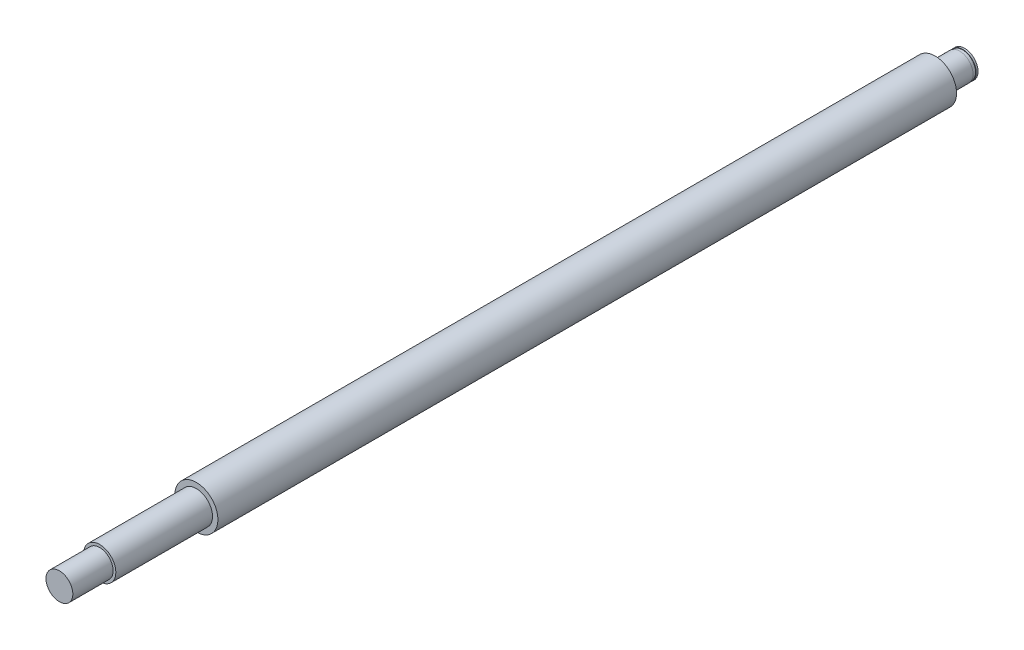
ISO-10303-21;
HEADER;
FILE_DESCRIPTION(('STEP AP214'),'2;1');
FILE_NAME('part.step','',(''),(''),'','','');
FILE_SCHEMA(('AUTOMOTIVE_DESIGN { 1 0 10303 214 1 1 1 1 }'));
ENDSEC;
DATA;
#1=APPLICATION_CONTEXT('core data for automotive mechanical design processes');
#2=APPLICATION_PROTOCOL_DEFINITION('international standard','automotive_design',2000,#1);
#3=PRODUCT_CONTEXT('',#1,'mechanical');
#4=PRODUCT('Part','Part','',(#3));
#5=PRODUCT_RELATED_PRODUCT_CATEGORY('part','',(#4));
#6=PRODUCT_DEFINITION_FORMATION('','',#4);
#7=PRODUCT_DEFINITION_CONTEXT('part definition',#1,'design');
#8=PRODUCT_DEFINITION('design','',#6,#7);
#9=PRODUCT_DEFINITION_SHAPE('','',#8);
#10=(LENGTH_UNIT() NAMED_UNIT(*) SI_UNIT(.MILLI.,.METRE.));
#11=(NAMED_UNIT(*) PLANE_ANGLE_UNIT() SI_UNIT($,.RADIAN.));
#12=(NAMED_UNIT(*) SI_UNIT($,.STERADIAN.) SOLID_ANGLE_UNIT());
#13=UNCERTAINTY_MEASURE_WITH_UNIT(LENGTH_MEASURE(1.E-05),#10,'distance_accuracy_value','');
#14=(GEOMETRIC_REPRESENTATION_CONTEXT(3) GLOBAL_UNCERTAINTY_ASSIGNED_CONTEXT((#13)) GLOBAL_UNIT_ASSIGNED_CONTEXT((#10,
#11,#12)) REPRESENTATION_CONTEXT('',''));
#15=CARTESIAN_POINT('',(0.,0.,0.));
#16=DIRECTION('',(0.,0.,1.));
#17=DIRECTION('',(1.,0.,0.));
#18=AXIS2_PLACEMENT_3D('',#15,#16,#17);
#19=CARTESIAN_POINT('',(0.,0.,-275.));
#20=DIRECTION('',(0.,0.,1.));
#21=DIRECTION('',(1.,0.,0.));
#22=AXIS2_PLACEMENT_3D('',#19,#20,#21);
#23=CYLINDRICAL_SURFACE('',#22,8.);
#24=CARTESIAN_POINT('',(0.,0.,-275.));
#25=DIRECTION('',(0.,0.,1.));
#26=DIRECTION('',(1.,0.,0.));
#27=AXIS2_PLACEMENT_3D('',#24,#25,#26);
#28=CIRCLE('',#27,8.);
#29=CARTESIAN_POINT('',(8.,0.,-275.));
#30=VERTEX_POINT('',#29);
#31=EDGE_CURVE('E76',#30,#30,#28,.T.);
#32=ORIENTED_EDGE('',*,*,#31,.T.);
#33=EDGE_LOOP('',(#32));
#34=FACE_BOUND('',#33,.T.);
#35=CARTESIAN_POINT('',(0.,0.,0.));
#36=DIRECTION('',(0.,0.,1.));
#37=DIRECTION('',(1.,0.,0.));
#38=AXIS2_PLACEMENT_3D('',#35,#36,#37);
#39=CIRCLE('',#38,8.);
#40=CARTESIAN_POINT('',(8.,0.,0.));
#41=VERTEX_POINT('',#40);
#42=EDGE_CURVE('E48',#41,#41,#39,.T.);
#43=ORIENTED_EDGE('',*,*,#42,.F.);
#44=EDGE_LOOP('',(#43));
#45=FACE_BOUND('',#44,.T.);
#46=ADVANCED_FACE('F45',(#34,#45),#23,.T.);
#47=CARTESIAN_POINT('',(0.,0.,-275.));
#48=DIRECTION('',(0.,0.,1.));
#49=DIRECTION('',(1.,0.,0.));
#50=AXIS2_PLACEMENT_3D('',#47,#48,#49);
#51=PLANE('',#50);
#52=CARTESIAN_POINT('',(0.,0.,-275.));
#53=DIRECTION('',(0.,0.,-1.));
#54=DIRECTION('',(-1.,0.,0.));
#55=AXIS2_PLACEMENT_3D('',#52,#53,#54);
#56=CIRCLE('',#55,5.);
#57=CARTESIAN_POINT('',(-5.,0.,-275.));
#58=VERTEX_POINT('',#57);
#59=EDGE_CURVE('E52',#58,#58,#56,.T.);
#60=ORIENTED_EDGE('',*,*,#59,.F.);
#61=EDGE_LOOP('',(#60));
#62=FACE_BOUND('',#61,.T.);
#63=ORIENTED_EDGE('',*,*,#31,.F.);
#64=EDGE_LOOP('',(#63));
#65=FACE_BOUND('',#64,.T.);
#66=ADVANCED_FACE('F86',(#62,#65),#51,.F.);
#67=CARTESIAN_POINT('',(0.,0.,0.));
#68=DIRECTION('',(0.,0.,1.));
#69=DIRECTION('',(1.,0.,0.));
#70=AXIS2_PLACEMENT_3D('',#67,#68,#69);
#71=PLANE('',#70);
#72=CARTESIAN_POINT('',(0.,0.,0.));
#73=DIRECTION('',(0.,0.,1.));
#74=DIRECTION('',(1.,0.,0.));
#75=AXIS2_PLACEMENT_3D('',#72,#73,#74);
#76=CIRCLE('',#75,6.);
#77=CARTESIAN_POINT('',(6.,0.,0.));
#78=VERTEX_POINT('',#77);
#79=EDGE_CURVE('E72',#78,#78,#76,.T.);
#80=ORIENTED_EDGE('',*,*,#79,.F.);
#81=EDGE_LOOP('',(#80));
#82=FACE_BOUND('',#81,.T.);
#83=ORIENTED_EDGE('',*,*,#42,.T.);
#84=EDGE_LOOP('',(#83));
#85=FACE_BOUND('',#84,.T.);
#86=ADVANCED_FACE('F83',(#82,#85),#71,.T.);
#87=CARTESIAN_POINT('',(0.,0.,36.));
#88=DIRECTION('',(0.,0.,-1.));
#89=DIRECTION('',(-1.,0.,0.));
#90=AXIS2_PLACEMENT_3D('',#87,#88,#89);
#91=CYLINDRICAL_SURFACE('',#90,6.);
#92=CARTESIAN_POINT('',(0.,0.,36.));
#93=DIRECTION('',(0.,0.,1.));
#94=DIRECTION('',(1.,0.,0.));
#95=AXIS2_PLACEMENT_3D('',#92,#93,#94);
#96=CIRCLE('',#95,6.);
#97=CARTESIAN_POINT('',(6.,0.,36.));
#98=VERTEX_POINT('',#97);
#99=EDGE_CURVE('E69',#98,#98,#96,.T.);
#100=ORIENTED_EDGE('',*,*,#99,.F.);
#101=EDGE_LOOP('',(#100));
#102=FACE_BOUND('',#101,.T.);
#103=ORIENTED_EDGE('',*,*,#79,.T.);
#104=EDGE_LOOP('',(#103));
#105=FACE_BOUND('',#104,.T.);
#106=ADVANCED_FACE('F95',(#102,#105),#91,.T.);
#107=CARTESIAN_POINT('',(0.,0.,36.));
#108=DIRECTION('',(0.,0.,1.));
#109=DIRECTION('',(1.,0.,0.));
#110=AXIS2_PLACEMENT_3D('',#107,#108,#109);
#111=PLANE('',#110);
#112=CARTESIAN_POINT('',(0.,0.,36.));
#113=DIRECTION('',(0.,0.,1.));
#114=DIRECTION('',(1.,0.,0.));
#115=AXIS2_PLACEMENT_3D('',#112,#113,#114);
#116=CIRCLE('',#115,5.);
#117=CARTESIAN_POINT('',(5.,0.,36.));
#118=VERTEX_POINT('',#117);
#119=EDGE_CURVE('E57',#118,#118,#116,.T.);
#120=ORIENTED_EDGE('',*,*,#119,.F.);
#121=EDGE_LOOP('',(#120));
#122=FACE_BOUND('',#121,.T.);
#123=ORIENTED_EDGE('',*,*,#99,.T.);
#124=EDGE_LOOP('',(#123));
#125=FACE_BOUND('',#124,.T.);
#126=ADVANCED_FACE('F102',(#122,#125),#111,.T.);
#127=CARTESIAN_POINT('',(0.,0.,51.));
#128=DIRECTION('',(0.,0.,-1.));
#129=DIRECTION('',(-1.,0.,0.));
#130=AXIS2_PLACEMENT_3D('',#127,#128,#129);
#131=CYLINDRICAL_SURFACE('',#130,5.);
#132=CARTESIAN_POINT('',(0.,0.,51.));
#133=DIRECTION('',(0.,0.,1.));
#134=DIRECTION('',(1.,0.,0.));
#135=AXIS2_PLACEMENT_3D('',#132,#133,#134);
#136=CIRCLE('',#135,5.);
#137=CARTESIAN_POINT('',(5.,0.,51.));
#138=VERTEX_POINT('',#137);
#139=EDGE_CURVE('E65',#138,#138,#136,.T.);
#140=ORIENTED_EDGE('',*,*,#139,.F.);
#141=EDGE_LOOP('',(#140));
#142=FACE_BOUND('',#141,.T.);
#143=ORIENTED_EDGE('',*,*,#119,.T.);
#144=EDGE_LOOP('',(#143));
#145=FACE_BOUND('',#144,.T.);
#146=ADVANCED_FACE('F106',(#142,#145),#131,.T.);
#147=CARTESIAN_POINT('',(0.,0.,51.));
#148=DIRECTION('',(0.,0.,1.));
#149=DIRECTION('',(1.,0.,0.));
#150=AXIS2_PLACEMENT_3D('',#147,#148,#149);
#151=PLANE('',#150);
#152=ORIENTED_EDGE('',*,*,#139,.T.);
#153=EDGE_LOOP('',(#152));
#154=FACE_BOUND('',#153,.T.);
#155=ADVANCED_FACE('F110',(#154),#151,.T.);
#156=CARTESIAN_POINT('',(0.,0.,-284.15));
#157=DIRECTION('',(0.,0.,1.));
#158=DIRECTION('',(1.,0.,0.));
#159=AXIS2_PLACEMENT_3D('',#156,#157,#158);
#160=CYLINDRICAL_SURFACE('',#159,5.);
#161=CARTESIAN_POINT('',(0.,0.,-284.15));
#162=DIRECTION('',(0.,0.,-1.));
#163=DIRECTION('',(-1.,0.,0.));
#164=AXIS2_PLACEMENT_3D('',#161,#162,#163);
#165=CIRCLE('',#164,5.);
#166=CARTESIAN_POINT('',(-5.,0.,-284.15));
#167=VERTEX_POINT('',#166);
#168=EDGE_CURVE('E63',#167,#167,#165,.T.);
#169=ORIENTED_EDGE('',*,*,#168,.F.);
#170=EDGE_LOOP('',(#169));
#171=FACE_BOUND('',#170,.T.);
#172=ORIENTED_EDGE('',*,*,#59,.T.);
#173=EDGE_LOOP('',(#172));
#174=FACE_BOUND('',#173,.T.);
#175=ADVANCED_FACE('F114',(#171,#174),#160,.T.);
#176=CARTESIAN_POINT('',(0.,0.,-284.15));
#177=DIRECTION('',(0.,0.,-1.));
#178=DIRECTION('',(-1.,0.,0.));
#179=AXIS2_PLACEMENT_3D('',#176,#177,#178);
#180=PLANE('',#179);
#181=CARTESIAN_POINT('',(0.,0.,-284.15));
#182=DIRECTION('',(0.,0.,-1.));
#183=DIRECTION('',(-1.,0.,0.));
#184=AXIS2_PLACEMENT_3D('',#181,#182,#183);
#185=CIRCLE('',#184,4.8);
#186=CARTESIAN_POINT('',(-4.8,0.,-284.15));
#187=VERTEX_POINT('',#186);
#188=EDGE_CURVE('E10',#187,#187,#185,.T.);
#189=ORIENTED_EDGE('',*,*,#188,.F.);
#190=EDGE_LOOP('',(#189));
#191=FACE_BOUND('',#190,.T.);
#192=ORIENTED_EDGE('',*,*,#168,.T.);
#193=EDGE_LOOP('',(#192));
#194=FACE_BOUND('',#193,.T.);
#195=ADVANCED_FACE('F118',(#191,#194),#180,.T.);
#196=CARTESIAN_POINT('',(0.,0.,-285.3));
#197=DIRECTION('',(0.,0.,1.));
#198=DIRECTION('',(1.,0.,0.));
#199=AXIS2_PLACEMENT_3D('',#196,#197,#198);
#200=CYLINDRICAL_SURFACE('',#199,4.8);
#201=CARTESIAN_POINT('',(0.,0.,-285.3));
#202=DIRECTION('',(0.,0.,-1.));
#203=DIRECTION('',(-1.,0.,0.));
#204=AXIS2_PLACEMENT_3D('',#201,#202,#203);
#205=CIRCLE('',#204,4.8);
#206=CARTESIAN_POINT('',(-4.8,0.,-285.3));
#207=VERTEX_POINT('',#206);
#208=EDGE_CURVE('E61',#207,#207,#205,.T.);
#209=ORIENTED_EDGE('',*,*,#208,.F.);
#210=EDGE_LOOP('',(#209));
#211=FACE_BOUND('',#210,.T.);
#212=ORIENTED_EDGE('',*,*,#188,.T.);
#213=EDGE_LOOP('',(#212));
#214=FACE_BOUND('',#213,.T.);
#215=ADVANCED_FACE('F122',(#211,#214),#200,.T.);
#216=CARTESIAN_POINT('',(0.,0.,-286.));
#217=DIRECTION('',(0.,0.,1.));
#218=DIRECTION('',(1.,0.,0.));
#219=AXIS2_PLACEMENT_3D('',#216,#217,#218);
#220=CYLINDRICAL_SURFACE('',#219,5.);
#221=CARTESIAN_POINT('',(0.,0.,-286.));
#222=DIRECTION('',(0.,0.,-1.));
#223=DIRECTION('',(-1.,0.,0.));
#224=AXIS2_PLACEMENT_3D('',#221,#222,#223);
#225=CIRCLE('',#224,5.);
#226=CARTESIAN_POINT('',(-5.,0.,-286.));
#227=VERTEX_POINT('',#226);
#228=EDGE_CURVE('E142',#227,#227,#225,.T.);
#229=ORIENTED_EDGE('',*,*,#228,.F.);
#230=EDGE_LOOP('',(#229));
#231=FACE_BOUND('',#230,.T.);
#232=CARTESIAN_POINT('',(0.,0.,-285.3));
#233=DIRECTION('',(0.,0.,-1.));
#234=DIRECTION('',(-1.,0.,0.));
#235=AXIS2_PLACEMENT_3D('',#232,#233,#234);
#236=CIRCLE('',#235,5.);
#237=CARTESIAN_POINT('',(-5.,0.,-285.3));
#238=VERTEX_POINT('',#237);
#239=EDGE_CURVE('E143',#238,#238,#236,.T.);
#240=ORIENTED_EDGE('',*,*,#239,.T.);
#241=EDGE_LOOP('',(#240));
#242=FACE_BOUND('',#241,.T.);
#243=ADVANCED_FACE('F126',(#231,#242),#220,.T.);
#244=CARTESIAN_POINT('',(0.,0.,-286.));
#245=DIRECTION('',(0.,0.,-1.));
#246=DIRECTION('',(-1.,0.,0.));
#247=AXIS2_PLACEMENT_3D('',#244,#245,#246);
#248=PLANE('',#247);
#249=ORIENTED_EDGE('',*,*,#228,.T.);
#250=EDGE_LOOP('',(#249));
#251=FACE_BOUND('',#250,.T.);
#252=ADVANCED_FACE('F130',(#251),#248,.T.);
#253=CARTESIAN_POINT('',(0.,0.,-285.3));
#254=DIRECTION('',(0.,0.,-1.));
#255=DIRECTION('',(-1.,0.,0.));
#256=AXIS2_PLACEMENT_3D('',#253,#254,#255);
#257=PLANE('',#256);
#258=ORIENTED_EDGE('',*,*,#208,.T.);
#259=EDGE_LOOP('',(#258));
#260=FACE_BOUND('',#259,.T.);
#261=ORIENTED_EDGE('',*,*,#239,.F.);
#262=EDGE_LOOP('',(#261));
#263=FACE_BOUND('',#262,.T.);
#264=ADVANCED_FACE('F132',(#260,#263),#257,.F.);
#265=CLOSED_SHELL('',(#46,#66,#86,#106,#126,#146,#155,#175,#195,#215,#243,#252,#264));
#266=MANIFOLD_SOLID_BREP('B2',#265);
#267=ADVANCED_BREP_SHAPE_REPRESENTATION('',(#18,#266),#14);
#268=SHAPE_DEFINITION_REPRESENTATION(#9,#267);
ENDSEC;
END-ISO-10303-21;
